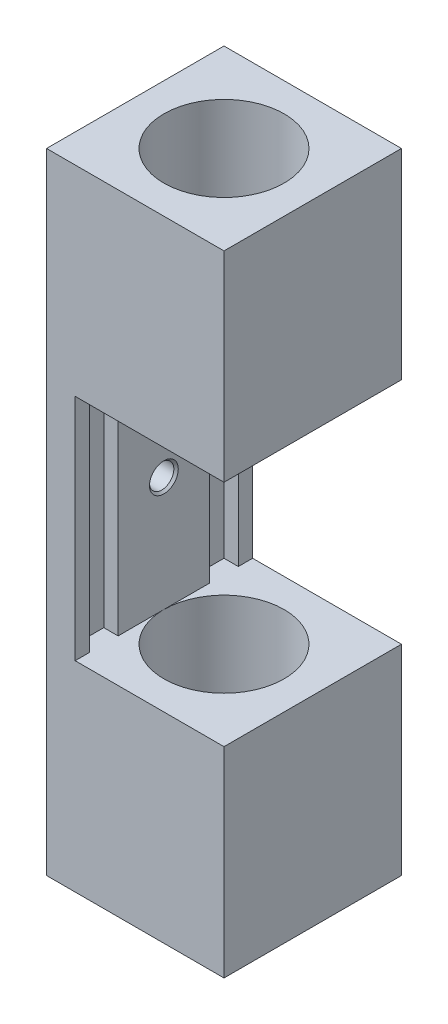
ISO-10303-21;
HEADER;
FILE_DESCRIPTION(('STEP AP214'),'2;1');
FILE_NAME('part.step','',(''),(''),'','','');
FILE_SCHEMA(('AUTOMOTIVE_DESIGN { 1 0 10303 214 1 1 1 1 }'));
ENDSEC;
DATA;
#1=APPLICATION_CONTEXT('core data for automotive mechanical design processes');
#2=APPLICATION_PROTOCOL_DEFINITION('international standard','automotive_design',2000,#1);
#3=PRODUCT_CONTEXT('',#1,'mechanical');
#4=PRODUCT('Part','Part','',(#3));
#5=PRODUCT_RELATED_PRODUCT_CATEGORY('part','',(#4));
#6=PRODUCT_DEFINITION_FORMATION('','',#4);
#7=PRODUCT_DEFINITION_CONTEXT('part definition',#1,'design');
#8=PRODUCT_DEFINITION('design','',#6,#7);
#9=PRODUCT_DEFINITION_SHAPE('','',#8);
#10=(LENGTH_UNIT() NAMED_UNIT(*) SI_UNIT(.MILLI.,.METRE.));
#11=(NAMED_UNIT(*) PLANE_ANGLE_UNIT() SI_UNIT($,.RADIAN.));
#12=(NAMED_UNIT(*) SI_UNIT($,.STERADIAN.) SOLID_ANGLE_UNIT());
#13=UNCERTAINTY_MEASURE_WITH_UNIT(LENGTH_MEASURE(1.E-05),#10,'distance_accuracy_value','');
#14=(GEOMETRIC_REPRESENTATION_CONTEXT(3) GLOBAL_UNCERTAINTY_ASSIGNED_CONTEXT((#13)) GLOBAL_UNIT_ASSIGNED_CONTEXT((#10,
#11,#12)) REPRESENTATION_CONTEXT('',''));
#15=CARTESIAN_POINT('',(0.,0.,0.));
#16=DIRECTION('',(0.,0.,1.));
#17=DIRECTION('',(1.,0.,0.));
#18=AXIS2_PLACEMENT_3D('',#15,#16,#17);
#19=CARTESIAN_POINT('',(-21.,70.,0.));
#20=DIRECTION('',(-1.,0.,0.));
#21=DIRECTION('',(0.,0.,1.));
#22=AXIS2_PLACEMENT_3D('',#19,#20,#21);
#23=PLANE('',#22);
#24=CARTESIAN_POINT('',(-21.,110.,0.));
#25=DIRECTION('',(1.,0.,0.));
#26=DIRECTION('',(0.,0.,-1.));
#27=AXIS2_PLACEMENT_3D('',#24,#25,#26);
#28=CIRCLE('',#27,5.025);
#29=CARTESIAN_POINT('',(-21.,110.,-5.025));
#30=VERTEX_POINT('',#29);
#31=EDGE_CURVE('E215',#30,#30,#28,.T.);
#32=ORIENTED_EDGE('',*,*,#31,.F.);
#33=EDGE_LOOP('',(#32));
#34=FACE_BOUND('',#33,.T.);
#35=DIRECTION('',(0.,0.,1.));
#36=VECTOR('',#35,1.);
#37=CARTESIAN_POINT('',(-21.,150.,0.));
#38=LINE('',#37,#36);
#39=CARTESIAN_POINT('',(-21.,150.,0.));
#40=VERTEX_POINT('',#39);
#41=CARTESIAN_POINT('',(-21.,150.,16.));
#42=VERTEX_POINT('',#41);
#43=EDGE_CURVE('E235',#40,#42,#38,.T.);
#44=ORIENTED_EDGE('',*,*,#43,.T.);
#45=DIRECTION('',(0.,1.,0.));
#46=VECTOR('',#45,1.);
#47=CARTESIAN_POINT('',(-21.,70.,16.));
#48=LINE('',#47,#46);
#49=CARTESIAN_POINT('',(-21.,70.,16.));
#50=VERTEX_POINT('',#49);
#51=EDGE_CURVE('E55',#50,#42,#48,.T.);
#52=ORIENTED_EDGE('',*,*,#51,.F.);
#53=DIRECTION('',(0.,0.,1.));
#54=VECTOR('',#53,1.);
#55=CARTESIAN_POINT('',(-21.,70.,37.1478009028206));
#56=LINE('',#55,#54);
#57=CARTESIAN_POINT('',(-21.,70.,0.));
#58=VERTEX_POINT('',#57);
#59=EDGE_CURVE('E229',#58,#50,#56,.T.);
#60=ORIENTED_EDGE('',*,*,#59,.F.);
#61=CARTESIAN_POINT('',(-21.,70.,-16.));
#62=VERTEX_POINT('',#61);
#63=EDGE_CURVE('E232',#62,#58,#56,.T.);
#64=ORIENTED_EDGE('',*,*,#63,.F.);
#65=DIRECTION('',(0.,-1.,0.));
#66=VECTOR('',#65,1.);
#67=CARTESIAN_POINT('',(-21.,0.,-16.));
#68=LINE('',#67,#66);
#69=CARTESIAN_POINT('',(-21.,150.,-16.));
#70=VERTEX_POINT('',#69);
#71=EDGE_CURVE('E200',#70,#62,#68,.T.);
#72=ORIENTED_EDGE('',*,*,#71,.F.);
#73=EDGE_CURVE('E238',#70,#40,#38,.T.);
#74=ORIENTED_EDGE('',*,*,#73,.T.);
#75=EDGE_LOOP('',(#44,#52,#60,#64,#72,#74));
#76=FACE_BOUND('',#75,.T.);
#77=ADVANCED_FACE('F40',(#34,#76),#23,.F.);
#78=CARTESIAN_POINT('',(-21.,70.,26.));
#79=VERTEX_POINT('',#78);
#80=CARTESIAN_POINT('',(-21.,70.,31.));
#81=VERTEX_POINT('',#80);
#82=EDGE_CURVE('E233',#79,#81,#56,.T.);
#83=ORIENTED_EDGE('',*,*,#82,.F.);
#84=DIRECTION('',(0.,-1.,0.));
#85=VECTOR('',#84,1.);
#86=CARTESIAN_POINT('',(-21.,150.,26.));
#87=LINE('',#86,#85);
#88=CARTESIAN_POINT('',(-21.,150.,26.));
#89=VERTEX_POINT('',#88);
#90=EDGE_CURVE('E185',#89,#79,#87,.T.);
#91=ORIENTED_EDGE('',*,*,#90,.F.);
#92=CARTESIAN_POINT('',(-21.,150.,31.));
#93=VERTEX_POINT('',#92);
#94=EDGE_CURVE('E167',#89,#93,#38,.T.);
#95=ORIENTED_EDGE('',*,*,#94,.T.);
#96=DIRECTION('',(0.,1.,0.));
#97=VECTOR('',#96,1.);
#98=CARTESIAN_POINT('',(-21.,220.,31.));
#99=LINE('',#98,#97);
#100=EDGE_CURVE('E48',#81,#93,#99,.T.);
#101=ORIENTED_EDGE('',*,*,#100,.F.);
#102=EDGE_LOOP('',(#83,#91,#95,#101));
#103=FACE_BOUND('',#102,.T.);
#104=ADVANCED_FACE('F314',(#103),#23,.F.);
#105=CARTESIAN_POINT('',(0.,220.,0.));
#106=DIRECTION('',(0.,-1.,0.));
#107=DIRECTION('',(0.,0.,-1.));
#108=AXIS2_PLACEMENT_3D('',#105,#106,#107);
#109=CYLINDRICAL_SURFACE('',#108,21.);
#110=CARTESIAN_POINT('',(0.,220.,0.));
#111=DIRECTION('',(0.,1.,0.));
#112=DIRECTION('',(0.,0.,1.));
#113=AXIS2_PLACEMENT_3D('',#110,#111,#112);
#114=CIRCLE('',#113,21.);
#115=CARTESIAN_POINT('',(0.,220.,21.));
#116=VERTEX_POINT('',#115);
#117=EDGE_CURVE('E268',#116,#116,#114,.T.);
#118=ORIENTED_EDGE('',*,*,#117,.T.);
#119=EDGE_LOOP('',(#118));
#120=FACE_BOUND('',#119,.T.);
#121=CARTESIAN_POINT('',(0.,150.,0.));
#122=DIRECTION('',(0.,-1.,0.));
#123=DIRECTION('',(0.,0.,-1.));
#124=AXIS2_PLACEMENT_3D('',#121,#122,#123);
#125=CIRCLE('',#124,21.);
#126=EDGE_CURVE('E244',#40,#40,#125,.T.);
#127=ORIENTED_EDGE('',*,*,#126,.T.);
#128=EDGE_LOOP('',(#127));
#129=FACE_BOUND('',#128,.T.);
#130=ADVANCED_FACE('F362',(#120,#129),#109,.F.);
#131=CARTESIAN_POINT('',(31.,220.,-31.));
#132=DIRECTION('',(-1.,0.,0.));
#133=DIRECTION('',(0.,0.,1.));
#134=AXIS2_PLACEMENT_3D('',#131,#132,#133);
#135=PLANE('',#134);
#136=DIRECTION('',(0.,0.,1.));
#137=VECTOR('',#136,1.);
#138=CARTESIAN_POINT('',(31.,150.,-31.));
#139=LINE('',#138,#137);
#140=CARTESIAN_POINT('',(31.,150.,-31.));
#141=VERTEX_POINT('',#140);
#142=CARTESIAN_POINT('',(31.,150.,31.));
#143=VERTEX_POINT('',#142);
#144=EDGE_CURVE('E240',#141,#143,#139,.T.);
#145=ORIENTED_EDGE('',*,*,#144,.F.);
#146=DIRECTION('',(0.,-1.,0.));
#147=VECTOR('',#146,1.);
#148=CARTESIAN_POINT('',(31.,220.,-31.));
#149=LINE('',#148,#147);
#150=CARTESIAN_POINT('',(31.,220.,-31.));
#151=VERTEX_POINT('',#150);
#152=EDGE_CURVE('E301',#151,#141,#149,.T.);
#153=ORIENTED_EDGE('',*,*,#152,.F.);
#154=DIRECTION('',(0.,0.,-1.));
#155=VECTOR('',#154,1.);
#156=CARTESIAN_POINT('',(31.,220.,-31.));
#157=LINE('',#156,#155);
#158=CARTESIAN_POINT('',(31.,220.,31.));
#159=VERTEX_POINT('',#158);
#160=EDGE_CURVE('E272',#159,#151,#157,.T.);
#161=ORIENTED_EDGE('',*,*,#160,.F.);
#162=DIRECTION('',(0.,-1.,0.));
#163=VECTOR('',#162,1.);
#164=CARTESIAN_POINT('',(31.,220.,31.));
#165=LINE('',#164,#163);
#166=EDGE_CURVE('E291',#159,#143,#165,.T.);
#167=ORIENTED_EDGE('',*,*,#166,.T.);
#168=EDGE_LOOP('',(#145,#153,#161,#167));
#169=FACE_BOUND('',#168,.T.);
#170=ADVANCED_FACE('F319',(#169),#135,.F.);
#171=CARTESIAN_POINT('',(0.,70.,0.));
#172=DIRECTION('',(0.,-1.,0.));
#173=DIRECTION('',(0.,0.,-1.));
#174=AXIS2_PLACEMENT_3D('',#171,#172,#173);
#175=CIRCLE('',#174,21.);
#176=EDGE_CURVE('E253',#58,#58,#175,.T.);
#177=ORIENTED_EDGE('',*,*,#176,.F.);
#178=EDGE_LOOP('',(#177));
#179=FACE_BOUND('',#178,.T.);
#180=CARTESIAN_POINT('',(0.,5.,0.));
#181=DIRECTION('',(0.,-1.,0.));
#182=DIRECTION('',(0.,0.,-1.));
#183=AXIS2_PLACEMENT_3D('',#180,#181,#182);
#184=CIRCLE('',#183,21.);
#185=CARTESIAN_POINT('',(0.,5.,-21.));
#186=VERTEX_POINT('',#185);
#187=EDGE_CURVE('E263',#186,#186,#184,.T.);
#188=ORIENTED_EDGE('',*,*,#187,.T.);
#189=EDGE_LOOP('',(#188));
#190=FACE_BOUND('',#189,.T.);
#191=ADVANCED_FACE('F358',(#179,#190),#109,.F.);
#192=CARTESIAN_POINT('',(0.,220.,0.));
#193=DIRECTION('',(0.,1.,0.));
#194=DIRECTION('',(0.,0.,1.));
#195=AXIS2_PLACEMENT_3D('',#192,#193,#194);
#196=PLANE('',#195);
#197=ORIENTED_EDGE('',*,*,#160,.T.);
#198=DIRECTION('',(-1.,0.,0.));
#199=VECTOR('',#198,1.);
#200=CARTESIAN_POINT('',(-31.,220.,-31.));
#201=LINE('',#200,#199);
#202=CARTESIAN_POINT('',(-31.,220.,-31.));
#203=VERTEX_POINT('',#202);
#204=EDGE_CURVE('E275',#151,#203,#201,.T.);
#205=ORIENTED_EDGE('',*,*,#204,.T.);
#206=DIRECTION('',(0.,0.,1.));
#207=VECTOR('',#206,1.);
#208=CARTESIAN_POINT('',(-31.,220.,-31.));
#209=LINE('',#208,#207);
#210=CARTESIAN_POINT('',(-31.,220.,31.));
#211=VERTEX_POINT('',#210);
#212=EDGE_CURVE('E278',#203,#211,#209,.T.);
#213=ORIENTED_EDGE('',*,*,#212,.T.);
#214=DIRECTION('',(1.,0.,0.));
#215=VECTOR('',#214,1.);
#216=CARTESIAN_POINT('',(-31.,220.,31.));
#217=LINE('',#216,#215);
#218=EDGE_CURVE('E280',#211,#159,#217,.T.);
#219=ORIENTED_EDGE('',*,*,#218,.T.);
#220=EDGE_LOOP('',(#197,#205,#213,#219));
#221=FACE_BOUND('',#220,.T.);
#222=ORIENTED_EDGE('',*,*,#117,.F.);
#223=EDGE_LOOP('',(#222));
#224=FACE_BOUND('',#223,.T.);
#225=ADVANCED_FACE('F326',(#221,#224),#196,.T.);
#226=CARTESIAN_POINT('',(0.,0.,0.));
#227=DIRECTION('',(0.,1.,0.));
#228=DIRECTION('',(0.,0.,1.));
#229=AXIS2_PLACEMENT_3D('',#226,#227,#228);
#230=PLANE('',#229);
#231=DIRECTION('',(0.,0.,-1.));
#232=VECTOR('',#231,1.);
#233=CARTESIAN_POINT('',(31.,0.,-31.));
#234=LINE('',#233,#232);
#235=CARTESIAN_POINT('',(31.,0.,31.));
#236=VERTEX_POINT('',#235);
#237=CARTESIAN_POINT('',(31.,0.,-31.));
#238=VERTEX_POINT('',#237);
#239=EDGE_CURVE('E271',#236,#238,#234,.T.);
#240=ORIENTED_EDGE('',*,*,#239,.F.);
#241=DIRECTION('',(1.,0.,0.));
#242=VECTOR('',#241,1.);
#243=CARTESIAN_POINT('',(-31.,0.,31.));
#244=LINE('',#243,#242);
#245=CARTESIAN_POINT('',(-31.,0.,31.));
#246=VERTEX_POINT('',#245);
#247=EDGE_CURVE('E276',#246,#236,#244,.T.);
#248=ORIENTED_EDGE('',*,*,#247,.F.);
#249=DIRECTION('',(0.,0.,1.));
#250=VECTOR('',#249,1.);
#251=CARTESIAN_POINT('',(-31.,0.,-31.));
#252=LINE('',#251,#250);
#253=CARTESIAN_POINT('',(-31.,0.,-31.));
#254=VERTEX_POINT('',#253);
#255=EDGE_CURVE('E287',#254,#246,#252,.T.);
#256=ORIENTED_EDGE('',*,*,#255,.F.);
#257=DIRECTION('',(-1.,0.,0.));
#258=VECTOR('',#257,1.);
#259=CARTESIAN_POINT('',(-31.,0.,-31.));
#260=LINE('',#259,#258);
#261=EDGE_CURVE('E285',#238,#254,#260,.T.);
#262=ORIENTED_EDGE('',*,*,#261,.F.);
#263=EDGE_LOOP('',(#240,#248,#256,#262));
#264=FACE_BOUND('',#263,.T.);
#265=CARTESIAN_POINT('',(0.,0.,0.));
#266=DIRECTION('',(0.,-1.,0.));
#267=DIRECTION('',(0.,0.,-1.));
#268=AXIS2_PLACEMENT_3D('',#265,#266,#267);
#269=CIRCLE('',#268,3.5);
#270=CARTESIAN_POINT('',(0.,0.,-3.5));
#271=VERTEX_POINT('',#270);
#272=EDGE_CURVE('E259',#271,#271,#269,.T.);
#273=ORIENTED_EDGE('',*,*,#272,.F.);
#274=EDGE_LOOP('',(#273));
#275=FACE_BOUND('',#274,.T.);
#276=ADVANCED_FACE('F335',(#264,#275),#230,.F.);
#277=CARTESIAN_POINT('',(31.,70.,-31.));
#278=VERTEX_POINT('',#277);
#279=EDGE_CURVE('E300',#278,#238,#149,.T.);
#280=ORIENTED_EDGE('',*,*,#279,.F.);
#281=DIRECTION('',(0.,0.,1.));
#282=VECTOR('',#281,1.);
#283=CARTESIAN_POINT('',(31.,70.,-31.));
#284=LINE('',#283,#282);
#285=CARTESIAN_POINT('',(31.,70.,31.));
#286=VERTEX_POINT('',#285);
#287=EDGE_CURVE('E247',#278,#286,#284,.T.);
#288=ORIENTED_EDGE('',*,*,#287,.T.);
#289=EDGE_CURVE('E282',#286,#236,#165,.T.);
#290=ORIENTED_EDGE('',*,*,#289,.T.);
#291=ORIENTED_EDGE('',*,*,#239,.T.);
#292=EDGE_LOOP('',(#280,#288,#290,#291));
#293=FACE_BOUND('',#292,.T.);
#294=ADVANCED_FACE('F42',(#293),#135,.F.);
#295=CARTESIAN_POINT('',(-31.,220.,-31.));
#296=DIRECTION('',(0.,0.,1.));
#297=DIRECTION('',(1.,0.,0.));
#298=AXIS2_PLACEMENT_3D('',#295,#296,#297);
#299=PLANE('',#298);
#300=DIRECTION('',(0.,-1.,0.));
#301=VECTOR('',#300,1.);
#302=CARTESIAN_POINT('',(-21.,220.,-31.));
#303=LINE('',#302,#301);
#304=CARTESIAN_POINT('',(-21.,150.,-31.));
#305=VERTEX_POINT('',#304);
#306=CARTESIAN_POINT('',(-21.,70.,-31.));
#307=VERTEX_POINT('',#306);
#308=EDGE_CURVE('E256',#305,#307,#303,.T.);
#309=ORIENTED_EDGE('',*,*,#308,.T.);
#310=DIRECTION('',(1.,0.,0.));
#311=VECTOR('',#310,1.);
#312=CARTESIAN_POINT('',(-31.,70.,-31.));
#313=LINE('',#312,#311);
#314=EDGE_CURVE('E250',#307,#278,#313,.T.);
#315=ORIENTED_EDGE('',*,*,#314,.T.);
#316=ORIENTED_EDGE('',*,*,#279,.T.);
#317=ORIENTED_EDGE('',*,*,#261,.T.);
#318=DIRECTION('',(0.,-1.,0.));
#319=VECTOR('',#318,1.);
#320=CARTESIAN_POINT('',(-31.,220.,-31.));
#321=LINE('',#320,#319);
#322=EDGE_CURVE('E297',#203,#254,#321,.T.);
#323=ORIENTED_EDGE('',*,*,#322,.F.);
#324=ORIENTED_EDGE('',*,*,#204,.F.);
#325=ORIENTED_EDGE('',*,*,#152,.T.);
#326=DIRECTION('',(1.,0.,0.));
#327=VECTOR('',#326,1.);
#328=CARTESIAN_POINT('',(-31.,150.,-31.));
#329=LINE('',#328,#327);
#330=EDGE_CURVE('E242',#305,#141,#329,.T.);
#331=ORIENTED_EDGE('',*,*,#330,.F.);
#332=EDGE_LOOP('',(#309,#315,#316,#317,#323,#324,#325,#331));
#333=FACE_BOUND('',#332,.T.);
#334=ADVANCED_FACE('F322',(#333),#299,.F.);
#335=CARTESIAN_POINT('',(-31.,220.,-31.));
#336=DIRECTION('',(1.,0.,0.));
#337=DIRECTION('',(0.,0.,-1.));
#338=AXIS2_PLACEMENT_3D('',#335,#336,#337);
#339=PLANE('',#338);
#340=CARTESIAN_POINT('',(-31.,110.,0.));
#341=DIRECTION('',(1.,0.,0.));
#342=DIRECTION('',(0.,0.,-1.));
#343=AXIS2_PLACEMENT_3D('',#340,#341,#342);
#344=CIRCLE('',#343,4.24999999999999);
#345=CARTESIAN_POINT('',(-31.,110.,-4.24999999999999));
#346=VERTEX_POINT('',#345);
#347=EDGE_CURVE('E226',#346,#346,#344,.T.);
#348=ORIENTED_EDGE('',*,*,#347,.T.);
#349=EDGE_LOOP('',(#348));
#350=FACE_BOUND('',#349,.T.);
#351=ORIENTED_EDGE('',*,*,#255,.T.);
#352=DIRECTION('',(0.,-1.,0.));
#353=VECTOR('',#352,1.);
#354=CARTESIAN_POINT('',(-31.,220.,31.));
#355=LINE('',#354,#353);
#356=EDGE_CURVE('E294',#211,#246,#355,.T.);
#357=ORIENTED_EDGE('',*,*,#356,.F.);
#358=ORIENTED_EDGE('',*,*,#212,.F.);
#359=ORIENTED_EDGE('',*,*,#322,.T.);
#360=EDGE_LOOP('',(#351,#357,#358,#359));
#361=FACE_BOUND('',#360,.T.);
#362=ADVANCED_FACE('F376',(#350,#361),#339,.F.);
#363=CARTESIAN_POINT('',(-31.,220.,31.));
#364=DIRECTION('',(0.,0.,-1.));
#365=DIRECTION('',(-1.,0.,0.));
#366=AXIS2_PLACEMENT_3D('',#363,#364,#365);
#367=PLANE('',#366);
#368=ORIENTED_EDGE('',*,*,#289,.F.);
#369=DIRECTION('',(-1.,0.,0.));
#370=VECTOR('',#369,1.);
#371=CARTESIAN_POINT('',(-31.,70.,31.));
#372=LINE('',#371,#370);
#373=EDGE_CURVE('E11',#286,#81,#372,.T.);
#374=ORIENTED_EDGE('',*,*,#373,.T.);
#375=ORIENTED_EDGE('',*,*,#100,.T.);
#376=DIRECTION('',(-1.,0.,0.));
#377=VECTOR('',#376,1.);
#378=CARTESIAN_POINT('',(-31.,150.,31.));
#379=LINE('',#378,#377);
#380=EDGE_CURVE('E304',#143,#93,#379,.T.);
#381=ORIENTED_EDGE('',*,*,#380,.F.);
#382=ORIENTED_EDGE('',*,*,#166,.F.);
#383=ORIENTED_EDGE('',*,*,#218,.F.);
#384=ORIENTED_EDGE('',*,*,#356,.T.);
#385=ORIENTED_EDGE('',*,*,#247,.T.);
#386=EDGE_LOOP('',(#368,#374,#375,#381,#382,#383,#384,#385));
#387=FACE_BOUND('',#386,.T.);
#388=ADVANCED_FACE('F310',(#387),#367,.F.);
#389=CARTESIAN_POINT('',(0.,5.,0.));
#390=DIRECTION('',(0.,-1.,0.));
#391=DIRECTION('',(0.,0.,-1.));
#392=AXIS2_PLACEMENT_3D('',#389,#390,#391);
#393=PLANE('',#392);
#394=CARTESIAN_POINT('',(0.,5.,0.));
#395=DIRECTION('',(0.,-1.,0.));
#396=DIRECTION('',(0.,0.,-1.));
#397=AXIS2_PLACEMENT_3D('',#394,#395,#396);
#398=CIRCLE('',#397,3.5);
#399=CARTESIAN_POINT('',(0.,5.,-3.5));
#400=VERTEX_POINT('',#399);
#401=EDGE_CURVE('E260',#400,#400,#398,.T.);
#402=ORIENTED_EDGE('',*,*,#401,.T.);
#403=EDGE_LOOP('',(#402));
#404=FACE_BOUND('',#403,.T.);
#405=ORIENTED_EDGE('',*,*,#187,.F.);
#406=EDGE_LOOP('',(#405));
#407=FACE_BOUND('',#406,.T.);
#408=ADVANCED_FACE('F365',(#404,#407),#393,.F.);
#409=CARTESIAN_POINT('',(0.,5.,0.));
#410=DIRECTION('',(0.,-1.,0.));
#411=DIRECTION('',(0.,0.,-1.));
#412=AXIS2_PLACEMENT_3D('',#409,#410,#411);
#413=CYLINDRICAL_SURFACE('',#412,3.5);
#414=ORIENTED_EDGE('',*,*,#401,.F.);
#415=EDGE_LOOP('',(#414));
#416=FACE_BOUND('',#415,.T.);
#417=ORIENTED_EDGE('',*,*,#272,.T.);
#418=EDGE_LOOP('',(#417));
#419=FACE_BOUND('',#418,.T.);
#420=ADVANCED_FACE('F367',(#416,#419),#413,.F.);
#421=CARTESIAN_POINT('',(-21.,150.,-26.));
#422=VERTEX_POINT('',#421);
#423=EDGE_CURVE('E239',#305,#422,#38,.T.);
#424=ORIENTED_EDGE('',*,*,#423,.T.);
#425=DIRECTION('',(0.,1.,0.));
#426=VECTOR('',#425,1.);
#427=CARTESIAN_POINT('',(-21.,0.,-26.));
#428=LINE('',#427,#426);
#429=CARTESIAN_POINT('',(-21.,70.,-26.));
#430=VERTEX_POINT('',#429);
#431=EDGE_CURVE('E63',#430,#422,#428,.T.);
#432=ORIENTED_EDGE('',*,*,#431,.F.);
#433=EDGE_CURVE('E234',#307,#430,#56,.T.);
#434=ORIENTED_EDGE('',*,*,#433,.F.);
#435=ORIENTED_EDGE('',*,*,#308,.F.);
#436=EDGE_LOOP('',(#424,#432,#434,#435));
#437=FACE_BOUND('',#436,.T.);
#438=ADVANCED_FACE('F346',(#437),#23,.F.);
#439=CARTESIAN_POINT('',(0.,70.,0.));
#440=DIRECTION('',(0.,-1.,0.));
#441=DIRECTION('',(0.,0.,-1.));
#442=AXIS2_PLACEMENT_3D('',#439,#440,#441);
#443=PLANE('',#442);
#444=ORIENTED_EDGE('',*,*,#59,.T.);
#445=DIRECTION('',(1.,0.,0.));
#446=VECTOR('',#445,1.);
#447=CARTESIAN_POINT('',(-26.,70.,16.));
#448=LINE('',#447,#446);
#449=CARTESIAN_POINT('',(-26.,70.,16.));
#450=VERTEX_POINT('',#449);
#451=EDGE_CURVE('E193',#450,#50,#448,.T.);
#452=ORIENTED_EDGE('',*,*,#451,.F.);
#453=DIRECTION('',(0.,0.,-1.));
#454=VECTOR('',#453,1.);
#455=CARTESIAN_POINT('',(-26.,70.,26.));
#456=LINE('',#455,#454);
#457=CARTESIAN_POINT('',(-26.,70.,26.));
#458=VERTEX_POINT('',#457);
#459=EDGE_CURVE('E180',#458,#450,#456,.T.);
#460=ORIENTED_EDGE('',*,*,#459,.F.);
#461=DIRECTION('',(1.,0.,0.));
#462=VECTOR('',#461,1.);
#463=CARTESIAN_POINT('',(-26.,70.,26.));
#464=LINE('',#463,#462);
#465=EDGE_CURVE('E171',#458,#79,#464,.T.);
#466=ORIENTED_EDGE('',*,*,#465,.T.);
#467=ORIENTED_EDGE('',*,*,#82,.T.);
#468=ORIENTED_EDGE('',*,*,#373,.F.);
#469=ORIENTED_EDGE('',*,*,#287,.F.);
#470=ORIENTED_EDGE('',*,*,#314,.F.);
#471=ORIENTED_EDGE('',*,*,#433,.T.);
#472=DIRECTION('',(1.,0.,0.));
#473=VECTOR('',#472,1.);
#474=CARTESIAN_POINT('',(-26.,70.,-26.));
#475=LINE('',#474,#473);
#476=CARTESIAN_POINT('',(-26.,70.,-26.));
#477=VERTEX_POINT('',#476);
#478=EDGE_CURVE('E209',#477,#430,#475,.T.);
#479=ORIENTED_EDGE('',*,*,#478,.F.);
#480=DIRECTION('',(0.,0.,-1.));
#481=VECTOR('',#480,1.);
#482=CARTESIAN_POINT('',(-26.,70.,0.));
#483=LINE('',#482,#481);
#484=CARTESIAN_POINT('',(-26.,70.,-16.));
#485=VERTEX_POINT('',#484);
#486=EDGE_CURVE('E196',#485,#477,#483,.T.);
#487=ORIENTED_EDGE('',*,*,#486,.F.);
#488=DIRECTION('',(1.,0.,0.));
#489=VECTOR('',#488,1.);
#490=CARTESIAN_POINT('',(-26.,70.,-16.));
#491=LINE('',#490,#489);
#492=EDGE_CURVE('E213',#485,#62,#491,.T.);
#493=ORIENTED_EDGE('',*,*,#492,.T.);
#494=ORIENTED_EDGE('',*,*,#63,.T.);
#495=ORIENTED_EDGE('',*,*,#176,.T.);
#496=EDGE_LOOP('',(#444,#452,#460,#466,#467,#468,#469,#470,#471,#479,#487,#493,#494,#495));
#497=FACE_BOUND('',#496,.T.);
#498=ADVANCED_FACE('F341',(#497),#443,.F.);
#499=CARTESIAN_POINT('',(0.,150.,0.));
#500=DIRECTION('',(0.,-1.,0.));
#501=DIRECTION('',(0.,0.,-1.));
#502=AXIS2_PLACEMENT_3D('',#499,#500,#501);
#503=PLANE('',#502);
#504=ORIENTED_EDGE('',*,*,#423,.F.);
#505=ORIENTED_EDGE('',*,*,#330,.T.);
#506=ORIENTED_EDGE('',*,*,#144,.T.);
#507=ORIENTED_EDGE('',*,*,#380,.T.);
#508=ORIENTED_EDGE('',*,*,#94,.F.);
#509=DIRECTION('',(1.,0.,0.));
#510=VECTOR('',#509,1.);
#511=CARTESIAN_POINT('',(-26.,150.,26.));
#512=LINE('',#511,#510);
#513=CARTESIAN_POINT('',(-26.,150.,26.));
#514=VERTEX_POINT('',#513);
#515=EDGE_CURVE('E159',#514,#89,#512,.T.);
#516=ORIENTED_EDGE('',*,*,#515,.F.);
#517=DIRECTION('',(0.,0.,1.));
#518=VECTOR('',#517,1.);
#519=CARTESIAN_POINT('',(-26.,150.,16.));
#520=LINE('',#519,#518);
#521=CARTESIAN_POINT('',(-26.,150.,16.));
#522=VERTEX_POINT('',#521);
#523=EDGE_CURVE('E164',#522,#514,#520,.T.);
#524=ORIENTED_EDGE('',*,*,#523,.F.);
#525=DIRECTION('',(1.,0.,0.));
#526=VECTOR('',#525,1.);
#527=CARTESIAN_POINT('',(-26.,150.,16.));
#528=LINE('',#527,#526);
#529=EDGE_CURVE('E191',#522,#42,#528,.T.);
#530=ORIENTED_EDGE('',*,*,#529,.T.);
#531=ORIENTED_EDGE('',*,*,#43,.F.);
#532=ORIENTED_EDGE('',*,*,#126,.F.);
#533=ORIENTED_EDGE('',*,*,#73,.F.);
#534=DIRECTION('',(1.,0.,0.));
#535=VECTOR('',#534,1.);
#536=CARTESIAN_POINT('',(-26.,150.,-16.));
#537=LINE('',#536,#535);
#538=CARTESIAN_POINT('',(-26.,150.,-16.));
#539=VERTEX_POINT('',#538);
#540=EDGE_CURVE('E216',#539,#70,#537,.T.);
#541=ORIENTED_EDGE('',*,*,#540,.F.);
#542=DIRECTION('',(0.,0.,1.));
#543=VECTOR('',#542,1.);
#544=CARTESIAN_POINT('',(-26.,150.,0.));
#545=LINE('',#544,#543);
#546=CARTESIAN_POINT('',(-26.,150.,-26.));
#547=VERTEX_POINT('',#546);
#548=EDGE_CURVE('E203',#547,#539,#545,.T.);
#549=ORIENTED_EDGE('',*,*,#548,.F.);
#550=DIRECTION('',(1.,0.,0.));
#551=VECTOR('',#550,1.);
#552=CARTESIAN_POINT('',(-26.,150.,-26.));
#553=LINE('',#552,#551);
#554=EDGE_CURVE('E218',#547,#422,#553,.T.);
#555=ORIENTED_EDGE('',*,*,#554,.T.);
#556=EDGE_LOOP('',(#504,#505,#506,#507,#508,#516,#524,#530,#531,#532,#533,#541,#549,#555));
#557=FACE_BOUND('',#556,.T.);
#558=ADVANCED_FACE('F162',(#557),#503,.T.);
#559=CARTESIAN_POINT('',(-21.,110.,0.));
#560=DIRECTION('',(1.,0.,0.));
#561=DIRECTION('',(0.,0.,-1.));
#562=AXIS2_PLACEMENT_3D('',#559,#560,#561);
#563=CYLINDRICAL_SURFACE('',#562,4.24999999999999);
#564=ORIENTED_EDGE('',*,*,#347,.F.);
#565=EDGE_LOOP('',(#564));
#566=FACE_BOUND('',#565,.T.);
#567=CARTESIAN_POINT('',(-21.775,110.,0.));
#568=DIRECTION('',(1.,0.,0.));
#569=DIRECTION('',(0.,0.,-1.));
#570=AXIS2_PLACEMENT_3D('',#567,#568,#569);
#571=CIRCLE('',#570,4.24999999999999);
#572=CARTESIAN_POINT('',(-21.775,110.,-4.24999999999999));
#573=VERTEX_POINT('',#572);
#574=EDGE_CURVE('E223',#573,#573,#571,.T.);
#575=ORIENTED_EDGE('',*,*,#574,.T.);
#576=EDGE_LOOP('',(#575));
#577=FACE_BOUND('',#576,.T.);
#578=ADVANCED_FACE('F394',(#566,#577),#563,.F.);
#579=CARTESIAN_POINT('',(-21.,110.,0.));
#580=DIRECTION('',(1.,0.,0.));
#581=DIRECTION('',(0.,0.,-1.));
#582=AXIS2_PLACEMENT_3D('',#579,#580,#581);
#583=CONICAL_SURFACE('',#582,5.025,0.785398163397455);
#584=ORIENTED_EDGE('',*,*,#574,.F.);
#585=EDGE_LOOP('',(#584));
#586=FACE_BOUND('',#585,.T.);
#587=ORIENTED_EDGE('',*,*,#31,.T.);
#588=EDGE_LOOP('',(#587));
#589=FACE_BOUND('',#588,.T.);
#590=ADVANCED_FACE('F398',(#586,#589),#583,.F.);
#591=CARTESIAN_POINT('',(-26.,0.,-16.));
#592=DIRECTION('',(0.,0.,1.));
#593=DIRECTION('',(0.,-1.,0.));
#594=AXIS2_PLACEMENT_3D('',#591,#592,#593);
#595=PLANE('',#594);
#596=ORIENTED_EDGE('',*,*,#71,.T.);
#597=ORIENTED_EDGE('',*,*,#492,.F.);
#598=DIRECTION('',(0.,-1.,0.));
#599=VECTOR('',#598,1.);
#600=CARTESIAN_POINT('',(-26.,0.,-16.));
#601=LINE('',#600,#599);
#602=EDGE_CURVE('E206',#539,#485,#601,.T.);
#603=ORIENTED_EDGE('',*,*,#602,.F.);
#604=ORIENTED_EDGE('',*,*,#540,.T.);
#605=EDGE_LOOP('',(#596,#597,#603,#604));
#606=FACE_BOUND('',#605,.T.);
#607=ADVANCED_FACE('F402',(#606),#595,.F.);
#608=CARTESIAN_POINT('',(-26.,0.,-26.));
#609=DIRECTION('',(0.,0.,-1.));
#610=DIRECTION('',(-1.,0.,0.));
#611=AXIS2_PLACEMENT_3D('',#608,#609,#610);
#612=PLANE('',#611);
#613=ORIENTED_EDGE('',*,*,#431,.T.);
#614=ORIENTED_EDGE('',*,*,#554,.F.);
#615=DIRECTION('',(0.,1.,0.));
#616=VECTOR('',#615,1.);
#617=CARTESIAN_POINT('',(-26.,0.,-26.));
#618=LINE('',#617,#616);
#619=EDGE_CURVE('E199',#477,#547,#618,.T.);
#620=ORIENTED_EDGE('',*,*,#619,.F.);
#621=ORIENTED_EDGE('',*,*,#478,.T.);
#622=EDGE_LOOP('',(#613,#614,#620,#621));
#623=FACE_BOUND('',#622,.T.);
#624=ADVANCED_FACE('F404',(#623),#612,.F.);
#625=CARTESIAN_POINT('',(-26.,0.,0.));
#626=DIRECTION('',(1.,0.,0.));
#627=DIRECTION('',(0.,0.,-1.));
#628=AXIS2_PLACEMENT_3D('',#625,#626,#627);
#629=PLANE('',#628);
#630=ORIENTED_EDGE('',*,*,#486,.T.);
#631=ORIENTED_EDGE('',*,*,#619,.T.);
#632=ORIENTED_EDGE('',*,*,#548,.T.);
#633=ORIENTED_EDGE('',*,*,#602,.T.);
#634=EDGE_LOOP('',(#630,#631,#632,#633));
#635=FACE_BOUND('',#634,.T.);
#636=ADVANCED_FACE('F407',(#635),#629,.T.);
#637=CARTESIAN_POINT('',(-26.,70.,16.));
#638=DIRECTION('',(0.,0.,-1.));
#639=DIRECTION('',(-1.,0.,0.));
#640=AXIS2_PLACEMENT_3D('',#637,#638,#639);
#641=PLANE('',#640);
#642=ORIENTED_EDGE('',*,*,#51,.T.);
#643=ORIENTED_EDGE('',*,*,#529,.F.);
#644=DIRECTION('',(0.,1.,0.));
#645=VECTOR('',#644,1.);
#646=CARTESIAN_POINT('',(-26.,70.,16.));
#647=LINE('',#646,#645);
#648=EDGE_CURVE('E172',#450,#522,#647,.T.);
#649=ORIENTED_EDGE('',*,*,#648,.F.);
#650=ORIENTED_EDGE('',*,*,#451,.T.);
#651=EDGE_LOOP('',(#642,#643,#649,#650));
#652=FACE_BOUND('',#651,.T.);
#653=ADVANCED_FACE('F354',(#652),#641,.F.);
#654=CARTESIAN_POINT('',(-26.,150.,26.));
#655=DIRECTION('',(0.,0.,1.));
#656=DIRECTION('',(0.,-1.,0.));
#657=AXIS2_PLACEMENT_3D('',#654,#655,#656);
#658=PLANE('',#657);
#659=ORIENTED_EDGE('',*,*,#90,.T.);
#660=ORIENTED_EDGE('',*,*,#465,.F.);
#661=DIRECTION('',(0.,-1.,0.));
#662=VECTOR('',#661,1.);
#663=CARTESIAN_POINT('',(-26.,150.,26.));
#664=LINE('',#663,#662);
#665=EDGE_CURVE('E175',#514,#458,#664,.T.);
#666=ORIENTED_EDGE('',*,*,#665,.F.);
#667=ORIENTED_EDGE('',*,*,#515,.T.);
#668=EDGE_LOOP('',(#659,#660,#666,#667));
#669=FACE_BOUND('',#668,.T.);
#670=ADVANCED_FACE('F176',(#669),#658,.F.);
#671=CARTESIAN_POINT('',(-26.,0.,0.));
#672=DIRECTION('',(1.,0.,0.));
#673=DIRECTION('',(0.,0.,-1.));
#674=AXIS2_PLACEMENT_3D('',#671,#672,#673);
#675=PLANE('',#674);
#676=ORIENTED_EDGE('',*,*,#523,.T.);
#677=ORIENTED_EDGE('',*,*,#665,.T.);
#678=ORIENTED_EDGE('',*,*,#459,.T.);
#679=ORIENTED_EDGE('',*,*,#648,.T.);
#680=EDGE_LOOP('',(#676,#677,#678,#679));
#681=FACE_BOUND('',#680,.T.);
#682=ADVANCED_FACE('F182',(#681),#675,.T.);
#683=CLOSED_SHELL('',(#77,#104,#130,#170,#191,#225,#276,#294,#334,#362,#388,#408,#420,#438,#498,
#558,#578,#590,#607,#624,#636,#653,#670,#682));
#684=MANIFOLD_SOLID_BREP('B2',#683);
#685=ADVANCED_BREP_SHAPE_REPRESENTATION('',(#18,#684),#14);
#686=SHAPE_DEFINITION_REPRESENTATION(#9,#685);
ENDSEC;
END-ISO-10303-21;
